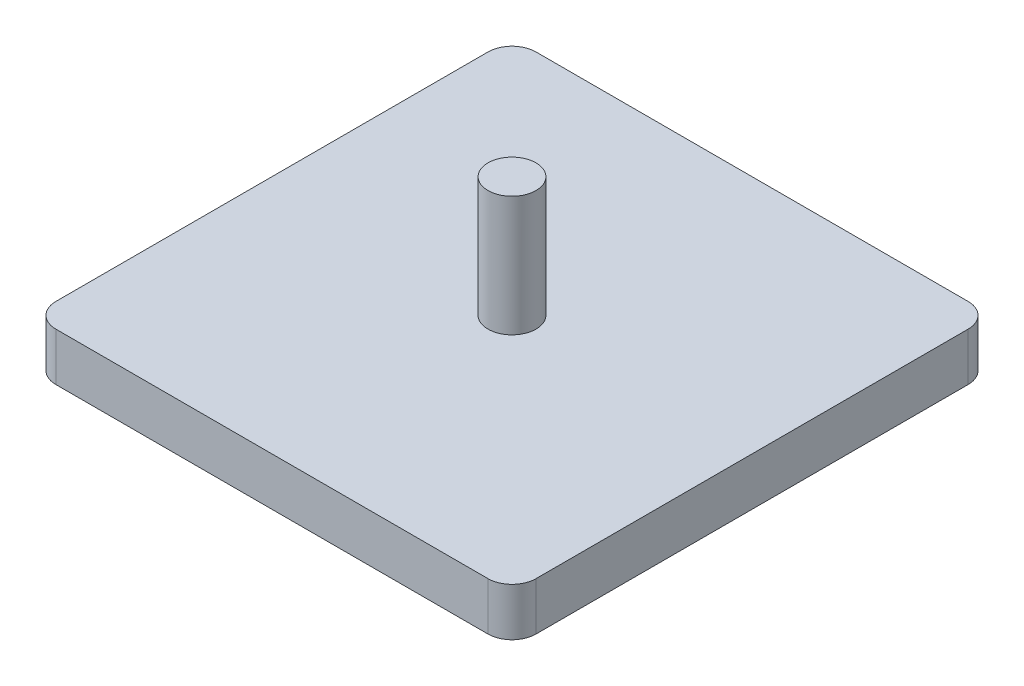
ISO-10303-21;
HEADER;
FILE_DESCRIPTION(('STEP AP214'),'2;1');
FILE_NAME('part.step','',(''),(''),'','','');
FILE_SCHEMA(('AUTOMOTIVE_DESIGN { 1 0 10303 214 1 1 1 1 }'));
ENDSEC;
DATA;
#1=APPLICATION_CONTEXT('core data for automotive mechanical design processes');
#2=APPLICATION_PROTOCOL_DEFINITION('international standard','automotive_design',2000,#1);
#3=PRODUCT_CONTEXT('',#1,'mechanical');
#4=PRODUCT('Part','Part','',(#3));
#5=PRODUCT_RELATED_PRODUCT_CATEGORY('part','',(#4));
#6=PRODUCT_DEFINITION_FORMATION('','',#4);
#7=PRODUCT_DEFINITION_CONTEXT('part definition',#1,'design');
#8=PRODUCT_DEFINITION('design','',#6,#7);
#9=PRODUCT_DEFINITION_SHAPE('','',#8);
#10=(LENGTH_UNIT() NAMED_UNIT(*) SI_UNIT(.MILLI.,.METRE.));
#11=(NAMED_UNIT(*) PLANE_ANGLE_UNIT() SI_UNIT($,.RADIAN.));
#12=(NAMED_UNIT(*) SI_UNIT($,.STERADIAN.) SOLID_ANGLE_UNIT());
#13=UNCERTAINTY_MEASURE_WITH_UNIT(LENGTH_MEASURE(1.E-05),#10,'distance_accuracy_value','');
#14=(GEOMETRIC_REPRESENTATION_CONTEXT(3) GLOBAL_UNCERTAINTY_ASSIGNED_CONTEXT((#13)) GLOBAL_UNIT_ASSIGNED_CONTEXT((#10,
#11,#12)) REPRESENTATION_CONTEXT('',''));
#15=CARTESIAN_POINT('',(0.,0.,0.));
#16=DIRECTION('',(0.,0.,1.));
#17=DIRECTION('',(1.,0.,0.));
#18=AXIS2_PLACEMENT_3D('',#15,#16,#17);
#19=CARTESIAN_POINT('',(-10.,2.,-10.));
#20=DIRECTION('',(1.,0.,0.));
#21=DIRECTION('',(0.,0.,-1.));
#22=AXIS2_PLACEMENT_3D('',#19,#20,#21);
#23=PLANE('',#22);
#24=DIRECTION('',(0.,0.,1.));
#25=VECTOR('',#24,1.);
#26=CARTESIAN_POINT('',(-10.,0.,-10.));
#27=LINE('',#26,#25);
#28=CARTESIAN_POINT('',(-10.,0.,-9.));
#29=VERTEX_POINT('',#28);
#30=CARTESIAN_POINT('',(-10.,0.,9.));
#31=VERTEX_POINT('',#30);
#32=EDGE_CURVE('E128',#29,#31,#27,.T.);
#33=ORIENTED_EDGE('',*,*,#32,.T.);
#34=DIRECTION('',(0.,-1.,0.));
#35=VECTOR('',#34,1.);
#36=CARTESIAN_POINT('',(-10.,2.,9.));
#37=LINE('',#36,#35);
#38=CARTESIAN_POINT('',(-10.,2.,9.));
#39=VERTEX_POINT('',#38);
#40=EDGE_CURVE('E11',#31,#39,#37,.F.);
#41=ORIENTED_EDGE('',*,*,#40,.T.);
#42=DIRECTION('',(0.,0.,1.));
#43=VECTOR('',#42,1.);
#44=CARTESIAN_POINT('',(-10.,2.,-10.));
#45=LINE('',#44,#43);
#46=CARTESIAN_POINT('',(-10.,2.,-9.));
#47=VERTEX_POINT('',#46);
#48=EDGE_CURVE('E126',#47,#39,#45,.T.);
#49=ORIENTED_EDGE('',*,*,#48,.F.);
#50=DIRECTION('',(0.,-1.,0.));
#51=VECTOR('',#50,1.);
#52=CARTESIAN_POINT('',(-10.,2.,-9.));
#53=LINE('',#52,#51);
#54=EDGE_CURVE('E40',#47,#29,#53,.T.);
#55=ORIENTED_EDGE('',*,*,#54,.T.);
#56=EDGE_LOOP('',(#33,#41,#49,#55));
#57=FACE_BOUND('',#56,.T.);
#58=ADVANCED_FACE('F32',(#57),#23,.F.);
#59=CARTESIAN_POINT('',(10.,2.,10.));
#60=DIRECTION('',(0.,0.,-1.));
#61=DIRECTION('',(-1.,0.,0.));
#62=AXIS2_PLACEMENT_3D('',#59,#60,#61);
#63=PLANE('',#62);
#64=DIRECTION('',(1.,0.,0.));
#65=VECTOR('',#64,1.);
#66=CARTESIAN_POINT('',(10.,0.,10.));
#67=LINE('',#66,#65);
#68=CARTESIAN_POINT('',(-9.,0.,10.));
#69=VERTEX_POINT('',#68);
#70=CARTESIAN_POINT('',(9.,0.,10.));
#71=VERTEX_POINT('',#70);
#72=EDGE_CURVE('E124',#69,#71,#67,.T.);
#73=ORIENTED_EDGE('',*,*,#72,.T.);
#74=DIRECTION('',(0.,-1.,0.));
#75=VECTOR('',#74,1.);
#76=CARTESIAN_POINT('',(9.,2.,10.));
#77=LINE('',#76,#75);
#78=CARTESIAN_POINT('',(9.,2.,10.));
#79=VERTEX_POINT('',#78);
#80=EDGE_CURVE('E103',#71,#79,#77,.F.);
#81=ORIENTED_EDGE('',*,*,#80,.T.);
#82=DIRECTION('',(1.,0.,0.));
#83=VECTOR('',#82,1.);
#84=CARTESIAN_POINT('',(10.,2.,10.));
#85=LINE('',#84,#83);
#86=CARTESIAN_POINT('',(-9.,2.,10.));
#87=VERTEX_POINT('',#86);
#88=EDGE_CURVE('E170',#87,#79,#85,.T.);
#89=ORIENTED_EDGE('',*,*,#88,.F.);
#90=DIRECTION('',(0.,-1.,0.));
#91=VECTOR('',#90,1.);
#92=CARTESIAN_POINT('',(-9.,2.,10.));
#93=LINE('',#92,#91);
#94=EDGE_CURVE('E108',#87,#69,#93,.T.);
#95=ORIENTED_EDGE('',*,*,#94,.T.);
#96=EDGE_LOOP('',(#73,#81,#89,#95));
#97=FACE_BOUND('',#96,.T.);
#98=ADVANCED_FACE('F180',(#97),#63,.F.);
#99=CARTESIAN_POINT('',(9.99999999999999,2.,-10.));
#100=DIRECTION('',(-1.,0.,0.));
#101=DIRECTION('',(0.,0.,1.));
#102=AXIS2_PLACEMENT_3D('',#99,#100,#101);
#103=PLANE('',#102);
#104=DIRECTION('',(0.,0.,-1.));
#105=VECTOR('',#104,1.);
#106=CARTESIAN_POINT('',(9.99999999999999,2.,-10.));
#107=LINE('',#106,#105);
#108=CARTESIAN_POINT('',(10.,2.,9.));
#109=VERTEX_POINT('',#108);
#110=CARTESIAN_POINT('',(9.99999999999999,2.,-9.00000000000001));
#111=VERTEX_POINT('',#110);
#112=EDGE_CURVE('E117',#109,#111,#107,.T.);
#113=ORIENTED_EDGE('',*,*,#112,.F.);
#114=DIRECTION('',(0.,-1.,0.));
#115=VECTOR('',#114,1.);
#116=CARTESIAN_POINT('',(10.,2.,9.));
#117=LINE('',#116,#115);
#118=CARTESIAN_POINT('',(10.,0.,9.));
#119=VERTEX_POINT('',#118);
#120=EDGE_CURVE('E102',#109,#119,#117,.T.);
#121=ORIENTED_EDGE('',*,*,#120,.T.);
#122=DIRECTION('',(0.,0.,-1.));
#123=VECTOR('',#122,1.);
#124=CARTESIAN_POINT('',(9.99999999999999,0.,-10.));
#125=LINE('',#124,#123);
#126=CARTESIAN_POINT('',(9.99999999999999,0.,-9.00000000000001));
#127=VERTEX_POINT('',#126);
#128=EDGE_CURVE('E115',#119,#127,#125,.T.);
#129=ORIENTED_EDGE('',*,*,#128,.T.);
#130=DIRECTION('',(0.,-1.,0.));
#131=VECTOR('',#130,1.);
#132=CARTESIAN_POINT('',(9.99999999999999,2.,-9.00000000000001));
#133=LINE('',#132,#131);
#134=EDGE_CURVE('E119',#127,#111,#133,.F.);
#135=ORIENTED_EDGE('',*,*,#134,.T.);
#136=EDGE_LOOP('',(#113,#121,#129,#135));
#137=FACE_BOUND('',#136,.T.);
#138=ADVANCED_FACE('F114',(#137),#103,.F.);
#139=CARTESIAN_POINT('',(9.99999999999999,2.,-10.));
#140=DIRECTION('',(0.,0.,1.));
#141=DIRECTION('',(1.,0.,0.));
#142=AXIS2_PLACEMENT_3D('',#139,#140,#141);
#143=PLANE('',#142);
#144=DIRECTION('',(-1.,0.,0.));
#145=VECTOR('',#144,1.);
#146=CARTESIAN_POINT('',(9.99999999999999,2.,-10.));
#147=LINE('',#146,#145);
#148=CARTESIAN_POINT('',(8.99999999999999,2.,-10.));
#149=VERTEX_POINT('',#148);
#150=CARTESIAN_POINT('',(-9.00000000000001,2.,-10.));
#151=VERTEX_POINT('',#150);
#152=EDGE_CURVE('E135',#149,#151,#147,.T.);
#153=ORIENTED_EDGE('',*,*,#152,.F.);
#154=DIRECTION('',(0.,-1.,0.));
#155=VECTOR('',#154,1.);
#156=CARTESIAN_POINT('',(8.99999999999999,2.,-10.));
#157=LINE('',#156,#155);
#158=CARTESIAN_POINT('',(8.99999999999999,0.,-10.));
#159=VERTEX_POINT('',#158);
#160=EDGE_CURVE('E152',#149,#159,#157,.T.);
#161=ORIENTED_EDGE('',*,*,#160,.T.);
#162=DIRECTION('',(-1.,0.,0.));
#163=VECTOR('',#162,1.);
#164=CARTESIAN_POINT('',(9.99999999999999,0.,-10.));
#165=LINE('',#164,#163);
#166=CARTESIAN_POINT('',(-9.00000000000001,0.,-10.));
#167=VERTEX_POINT('',#166);
#168=EDGE_CURVE('E123',#159,#167,#165,.T.);
#169=ORIENTED_EDGE('',*,*,#168,.T.);
#170=DIRECTION('',(0.,-1.,0.));
#171=VECTOR('',#170,1.);
#172=CARTESIAN_POINT('',(-9.00000000000001,2.,-10.));
#173=LINE('',#172,#171);
#174=EDGE_CURVE('E47',#167,#151,#173,.F.);
#175=ORIENTED_EDGE('',*,*,#174,.T.);
#176=EDGE_LOOP('',(#153,#161,#169,#175));
#177=FACE_BOUND('',#176,.T.);
#178=ADVANCED_FACE('F184',(#177),#143,.F.);
#179=CARTESIAN_POINT('',(0.,2.,0.));
#180=DIRECTION('',(0.,-1.,0.));
#181=DIRECTION('',(0.,0.,-1.));
#182=AXIS2_PLACEMENT_3D('',#179,#180,#181);
#183=PLANE('',#182);
#184=CARTESIAN_POINT('',(0.,2.,0.));
#185=DIRECTION('',(0.,-1.,0.));
#186=DIRECTION('',(0.,0.,-1.));
#187=AXIS2_PLACEMENT_3D('',#184,#185,#186);
#188=CIRCLE('',#187,1.);
#189=CARTESIAN_POINT('',(0.,2.,-1.));
#190=VERTEX_POINT('',#189);
#191=EDGE_CURVE('E132',#190,#190,#188,.F.);
#192=ORIENTED_EDGE('',*,*,#191,.F.);
#193=EDGE_LOOP('',(#192));
#194=FACE_BOUND('',#193,.T.);
#195=ORIENTED_EDGE('',*,*,#88,.T.);
#196=CARTESIAN_POINT('',(9.,2.,9.));
#197=DIRECTION('',(0.,-1.,0.));
#198=DIRECTION('',(0.,0.,-1.));
#199=AXIS2_PLACEMENT_3D('',#196,#197,#198);
#200=CIRCLE('',#199,1.);
#201=EDGE_CURVE('E149',#79,#109,#200,.F.);
#202=ORIENTED_EDGE('',*,*,#201,.T.);
#203=ORIENTED_EDGE('',*,*,#112,.T.);
#204=CARTESIAN_POINT('',(8.99999999999999,2.,-9.00000000000001));
#205=DIRECTION('',(0.,-1.,0.));
#206=DIRECTION('',(0.,0.,-1.));
#207=AXIS2_PLACEMENT_3D('',#204,#205,#206);
#208=CIRCLE('',#207,1.);
#209=EDGE_CURVE('E54',#111,#149,#208,.F.);
#210=ORIENTED_EDGE('',*,*,#209,.T.);
#211=ORIENTED_EDGE('',*,*,#152,.T.);
#212=CARTESIAN_POINT('',(-9.00000000000001,2.,-9.));
#213=DIRECTION('',(0.,-1.,0.));
#214=DIRECTION('',(0.,0.,-1.));
#215=AXIS2_PLACEMENT_3D('',#212,#213,#214);
#216=CIRCLE('',#215,1.);
#217=EDGE_CURVE('E144',#151,#47,#216,.F.);
#218=ORIENTED_EDGE('',*,*,#217,.T.);
#219=ORIENTED_EDGE('',*,*,#48,.T.);
#220=CARTESIAN_POINT('',(-9.,2.,9.));
#221=DIRECTION('',(0.,-1.,0.));
#222=DIRECTION('',(0.,0.,-1.));
#223=AXIS2_PLACEMENT_3D('',#220,#221,#222);
#224=CIRCLE('',#223,1.);
#225=EDGE_CURVE('E146',#39,#87,#224,.F.);
#226=ORIENTED_EDGE('',*,*,#225,.T.);
#227=EDGE_LOOP('',(#195,#202,#203,#210,#211,#218,#219,#226));
#228=FACE_BOUND('',#227,.T.);
#229=ADVANCED_FACE('F174',(#194,#228),#183,.F.);
#230=CARTESIAN_POINT('',(0.,0.,0.));
#231=DIRECTION('',(0.,-1.,0.));
#232=DIRECTION('',(0.,0.,-1.));
#233=AXIS2_PLACEMENT_3D('',#230,#231,#232);
#234=PLANE('',#233);
#235=ORIENTED_EDGE('',*,*,#128,.F.);
#236=CARTESIAN_POINT('',(9.,0.,9.));
#237=DIRECTION('',(0.,-1.,0.));
#238=DIRECTION('',(0.,0.,-1.));
#239=AXIS2_PLACEMENT_3D('',#236,#237,#238);
#240=CIRCLE('',#239,1.);
#241=EDGE_CURVE('E98',#119,#71,#240,.T.);
#242=ORIENTED_EDGE('',*,*,#241,.T.);
#243=ORIENTED_EDGE('',*,*,#72,.F.);
#244=CARTESIAN_POINT('',(-9.,0.,9.));
#245=DIRECTION('',(0.,-1.,0.));
#246=DIRECTION('',(0.,0.,-1.));
#247=AXIS2_PLACEMENT_3D('',#244,#245,#246);
#248=CIRCLE('',#247,1.);
#249=EDGE_CURVE('E138',#69,#31,#248,.T.);
#250=ORIENTED_EDGE('',*,*,#249,.T.);
#251=ORIENTED_EDGE('',*,*,#32,.F.);
#252=CARTESIAN_POINT('',(-9.00000000000001,0.,-9.));
#253=DIRECTION('',(0.,-1.,0.));
#254=DIRECTION('',(0.,0.,-1.));
#255=AXIS2_PLACEMENT_3D('',#252,#253,#254);
#256=CIRCLE('',#255,1.);
#257=EDGE_CURVE('E118',#29,#167,#256,.T.);
#258=ORIENTED_EDGE('',*,*,#257,.T.);
#259=ORIENTED_EDGE('',*,*,#168,.F.);
#260=CARTESIAN_POINT('',(8.99999999999999,0.,-9.00000000000001));
#261=DIRECTION('',(0.,-1.,0.));
#262=DIRECTION('',(0.,0.,-1.));
#263=AXIS2_PLACEMENT_3D('',#260,#261,#262);
#264=CIRCLE('',#263,1.);
#265=EDGE_CURVE('E109',#159,#127,#264,.T.);
#266=ORIENTED_EDGE('',*,*,#265,.T.);
#267=EDGE_LOOP('',(#235,#242,#243,#250,#251,#258,#259,#266));
#268=FACE_BOUND('',#267,.T.);
#269=ADVANCED_FACE('F121',(#268),#234,.T.);
#270=CARTESIAN_POINT('',(0.,7.,0.));
#271=DIRECTION('',(0.,-1.,0.));
#272=DIRECTION('',(0.,0.,-1.));
#273=AXIS2_PLACEMENT_3D('',#270,#271,#272);
#274=CYLINDRICAL_SURFACE('',#273,1.);
#275=CARTESIAN_POINT('',(0.,7.,0.));
#276=DIRECTION('',(0.,1.,0.));
#277=DIRECTION('',(0.,0.,1.));
#278=AXIS2_PLACEMENT_3D('',#275,#276,#277);
#279=CIRCLE('',#278,1.);
#280=CARTESIAN_POINT('',(0.,7.,1.));
#281=VERTEX_POINT('',#280);
#282=EDGE_CURVE('E164',#281,#281,#279,.T.);
#283=ORIENTED_EDGE('',*,*,#282,.F.);
#284=EDGE_LOOP('',(#283));
#285=FACE_BOUND('',#284,.T.);
#286=ORIENTED_EDGE('',*,*,#191,.T.);
#287=EDGE_LOOP('',(#286));
#288=FACE_BOUND('',#287,.T.);
#289=ADVANCED_FACE('F230',(#285,#288),#274,.T.);
#290=CARTESIAN_POINT('',(0.,7.,0.));
#291=DIRECTION('',(0.,1.,0.));
#292=DIRECTION('',(0.,0.,1.));
#293=AXIS2_PLACEMENT_3D('',#290,#291,#292);
#294=PLANE('',#293);
#295=ORIENTED_EDGE('',*,*,#282,.T.);
#296=EDGE_LOOP('',(#295));
#297=FACE_BOUND('',#296,.T.);
#298=ADVANCED_FACE('F199',(#297),#294,.T.);
#299=CARTESIAN_POINT('',(9.,2.,9.));
#300=DIRECTION('',(0.,-1.,0.));
#301=DIRECTION('',(0.,0.,-1.));
#302=AXIS2_PLACEMENT_3D('',#299,#300,#301);
#303=CYLINDRICAL_SURFACE('',#302,1.);
#304=ORIENTED_EDGE('',*,*,#201,.F.);
#305=ORIENTED_EDGE('',*,*,#80,.F.);
#306=ORIENTED_EDGE('',*,*,#241,.F.);
#307=ORIENTED_EDGE('',*,*,#120,.F.);
#308=EDGE_LOOP('',(#304,#305,#306,#307));
#309=FACE_BOUND('',#308,.T.);
#310=ADVANCED_FACE('F101',(#309),#303,.T.);
#311=CARTESIAN_POINT('',(8.99999999999999,2.,-9.00000000000001));
#312=DIRECTION('',(0.,-1.,0.));
#313=DIRECTION('',(0.,0.,-1.));
#314=AXIS2_PLACEMENT_3D('',#311,#312,#313);
#315=CYLINDRICAL_SURFACE('',#314,1.);
#316=ORIENTED_EDGE('',*,*,#209,.F.);
#317=ORIENTED_EDGE('',*,*,#134,.F.);
#318=ORIENTED_EDGE('',*,*,#265,.F.);
#319=ORIENTED_EDGE('',*,*,#160,.F.);
#320=EDGE_LOOP('',(#316,#317,#318,#319));
#321=FACE_BOUND('',#320,.T.);
#322=ADVANCED_FACE('F183',(#321),#315,.T.);
#323=CARTESIAN_POINT('',(-9.,2.,9.));
#324=DIRECTION('',(0.,-1.,0.));
#325=DIRECTION('',(0.,0.,-1.));
#326=AXIS2_PLACEMENT_3D('',#323,#324,#325);
#327=CYLINDRICAL_SURFACE('',#326,1.);
#328=ORIENTED_EDGE('',*,*,#225,.F.);
#329=ORIENTED_EDGE('',*,*,#40,.F.);
#330=ORIENTED_EDGE('',*,*,#249,.F.);
#331=ORIENTED_EDGE('',*,*,#94,.F.);
#332=EDGE_LOOP('',(#328,#329,#330,#331));
#333=FACE_BOUND('',#332,.T.);
#334=ADVANCED_FACE('F178',(#333),#327,.T.);
#335=CARTESIAN_POINT('',(-9.00000000000001,2.,-9.));
#336=DIRECTION('',(0.,-1.,0.));
#337=DIRECTION('',(0.,0.,-1.));
#338=AXIS2_PLACEMENT_3D('',#335,#336,#337);
#339=CYLINDRICAL_SURFACE('',#338,1.);
#340=ORIENTED_EDGE('',*,*,#217,.F.);
#341=ORIENTED_EDGE('',*,*,#174,.F.);
#342=ORIENTED_EDGE('',*,*,#257,.F.);
#343=ORIENTED_EDGE('',*,*,#54,.F.);
#344=EDGE_LOOP('',(#340,#341,#342,#343));
#345=FACE_BOUND('',#344,.T.);
#346=ADVANCED_FACE('F34',(#345),#339,.T.);
#347=CLOSED_SHELL('',(#58,#98,#138,#178,#229,#269,#289,#298,#310,#322,#334,#346));
#348=MANIFOLD_SOLID_BREP('B2',#347);
#349=ADVANCED_BREP_SHAPE_REPRESENTATION('',(#18,#348),#14);
#350=SHAPE_DEFINITION_REPRESENTATION(#9,#349);
ENDSEC;
END-ISO-10303-21;
